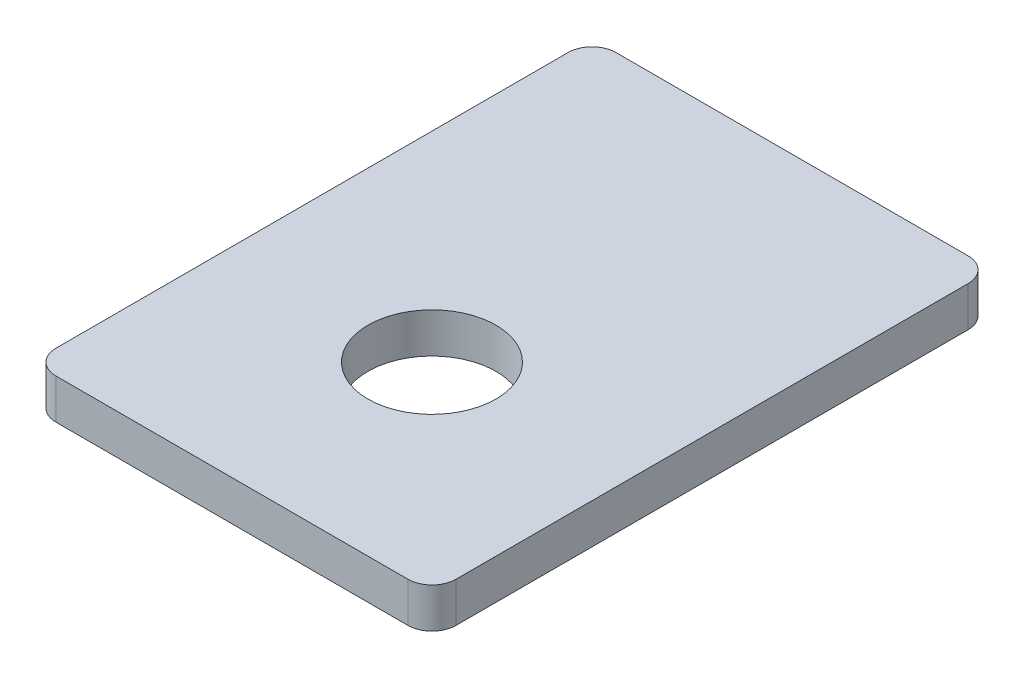
ISO-10303-21;
HEADER;
FILE_DESCRIPTION(('STEP AP214'),'2;1');
FILE_NAME('part.step','',(''),(''),'','','');
FILE_SCHEMA(('AUTOMOTIVE_DESIGN { 1 0 10303 214 1 1 1 1 }'));
ENDSEC;
DATA;
#1=APPLICATION_CONTEXT('core data for automotive mechanical design processes');
#2=APPLICATION_PROTOCOL_DEFINITION('international standard','automotive_design',2000,#1);
#3=PRODUCT_CONTEXT('',#1,'mechanical');
#4=PRODUCT('Part','Part','',(#3));
#5=PRODUCT_RELATED_PRODUCT_CATEGORY('part','',(#4));
#6=PRODUCT_DEFINITION_FORMATION('','',#4);
#7=PRODUCT_DEFINITION_CONTEXT('part definition',#1,'design');
#8=PRODUCT_DEFINITION('design','',#6,#7);
#9=PRODUCT_DEFINITION_SHAPE('','',#8);
#10=(LENGTH_UNIT() NAMED_UNIT(*) SI_UNIT(.MILLI.,.METRE.));
#11=(NAMED_UNIT(*) PLANE_ANGLE_UNIT() SI_UNIT($,.RADIAN.));
#12=(NAMED_UNIT(*) SI_UNIT($,.STERADIAN.) SOLID_ANGLE_UNIT());
#13=UNCERTAINTY_MEASURE_WITH_UNIT(LENGTH_MEASURE(1.E-05),#10,'distance_accuracy_value','');
#14=(GEOMETRIC_REPRESENTATION_CONTEXT(3) GLOBAL_UNCERTAINTY_ASSIGNED_CONTEXT((#13)) GLOBAL_UNIT_ASSIGNED_CONTEXT((#10,
#11,#12)) REPRESENTATION_CONTEXT('',''));
#15=CARTESIAN_POINT('',(0.,0.,0.));
#16=DIRECTION('',(0.,0.,1.));
#17=DIRECTION('',(1.,0.,0.));
#18=AXIS2_PLACEMENT_3D('',#15,#16,#17);
#19=CARTESIAN_POINT('',(0.,5.,70.));
#20=DIRECTION('',(1.,0.,0.));
#21=DIRECTION('',(0.,0.,-1.));
#22=AXIS2_PLACEMENT_3D('',#19,#20,#21);
#23=PLANE('',#22);
#24=DIRECTION('',(0.,0.,-1.));
#25=VECTOR('',#24,1.);
#26=CARTESIAN_POINT('',(0.,5.,70.));
#27=LINE('',#26,#25);
#28=CARTESIAN_POINT('',(0.,5.,67.));
#29=VERTEX_POINT('',#28);
#30=CARTESIAN_POINT('',(0.,5.,3.));
#31=VERTEX_POINT('',#30);
#32=EDGE_CURVE('E160',#29,#31,#27,.T.);
#33=ORIENTED_EDGE('',*,*,#32,.T.);
#34=DIRECTION('',(0.,-1.,0.));
#35=VECTOR('',#34,1.);
#36=CARTESIAN_POINT('',(0.,5.,3.));
#37=LINE('',#36,#35);
#38=CARTESIAN_POINT('',(0.,0.,3.));
#39=VERTEX_POINT('',#38);
#40=EDGE_CURVE('E124',#31,#39,#37,.T.);
#41=ORIENTED_EDGE('',*,*,#40,.T.);
#42=DIRECTION('',(0.,0.,-1.));
#43=VECTOR('',#42,1.);
#44=CARTESIAN_POINT('',(0.,0.,70.));
#45=LINE('',#44,#43);
#46=CARTESIAN_POINT('',(0.,0.,67.));
#47=VERTEX_POINT('',#46);
#48=EDGE_CURVE('E109',#47,#39,#45,.T.);
#49=ORIENTED_EDGE('',*,*,#48,.F.);
#50=DIRECTION('',(0.,-1.,0.));
#51=VECTOR('',#50,1.);
#52=CARTESIAN_POINT('',(0.,5.,67.));
#53=LINE('',#52,#51);
#54=EDGE_CURVE('E121',#47,#29,#53,.F.);
#55=ORIENTED_EDGE('',*,*,#54,.T.);
#56=EDGE_LOOP('',(#33,#41,#49,#55));
#57=FACE_BOUND('',#56,.T.);
#58=ADVANCED_FACE('F39',(#57),#23,.F.);
#59=CARTESIAN_POINT('',(0.,0.,70.));
#60=DIRECTION('',(0.,1.,0.));
#61=DIRECTION('',(0.,0.,1.));
#62=AXIS2_PLACEMENT_3D('',#59,#60,#61);
#63=PLANE('',#62);
#64=CARTESIAN_POINT('',(25.,0.,45.));
#65=DIRECTION('',(0.,1.,0.));
#66=DIRECTION('',(0.,0.,1.));
#67=AXIS2_PLACEMENT_3D('',#64,#65,#66);
#68=CIRCLE('',#67,8.);
#69=CARTESIAN_POINT('',(25.,0.,53.));
#70=VERTEX_POINT('',#69);
#71=EDGE_CURVE('E171',#70,#70,#68,.T.);
#72=ORIENTED_EDGE('',*,*,#71,.T.);
#73=EDGE_LOOP('',(#72));
#74=FACE_BOUND('',#73,.T.);
#75=ORIENTED_EDGE('',*,*,#48,.T.);
#76=CARTESIAN_POINT('',(3.,0.,3.));
#77=DIRECTION('',(0.,1.,0.));
#78=DIRECTION('',(0.,0.,1.));
#79=AXIS2_PLACEMENT_3D('',#76,#77,#78);
#80=CIRCLE('',#79,3.);
#81=CARTESIAN_POINT('',(3.,0.,0.));
#82=VERTEX_POINT('',#81);
#83=EDGE_CURVE('E136',#39,#82,#80,.F.);
#84=ORIENTED_EDGE('',*,*,#83,.T.);
#85=DIRECTION('',(1.,0.,0.));
#86=VECTOR('',#85,1.);
#87=CARTESIAN_POINT('',(0.,0.,0.));
#88=LINE('',#87,#86);
#89=CARTESIAN_POINT('',(47.,0.,0.));
#90=VERTEX_POINT('',#89);
#91=EDGE_CURVE('E168',#82,#90,#88,.T.);
#92=ORIENTED_EDGE('',*,*,#91,.T.);
#93=CARTESIAN_POINT('',(47.,0.,3.));
#94=DIRECTION('',(0.,1.,0.));
#95=DIRECTION('',(0.,0.,1.));
#96=AXIS2_PLACEMENT_3D('',#93,#94,#95);
#97=CIRCLE('',#96,3.);
#98=CARTESIAN_POINT('',(50.,0.,3.));
#99=VERTEX_POINT('',#98);
#100=EDGE_CURVE('E115',#90,#99,#97,.F.);
#101=ORIENTED_EDGE('',*,*,#100,.T.);
#102=DIRECTION('',(0.,0.,-1.));
#103=VECTOR('',#102,1.);
#104=CARTESIAN_POINT('',(50.,0.,70.));
#105=LINE('',#104,#103);
#106=CARTESIAN_POINT('',(50.,0.,67.));
#107=VERTEX_POINT('',#106);
#108=EDGE_CURVE('E125',#107,#99,#105,.T.);
#109=ORIENTED_EDGE('',*,*,#108,.F.);
#110=CARTESIAN_POINT('',(47.,0.,67.));
#111=DIRECTION('',(0.,1.,0.));
#112=DIRECTION('',(0.,0.,1.));
#113=AXIS2_PLACEMENT_3D('',#110,#111,#112);
#114=CIRCLE('',#113,3.);
#115=CARTESIAN_POINT('',(47.,0.,70.));
#116=VERTEX_POINT('',#115);
#117=EDGE_CURVE('E116',#107,#116,#114,.F.);
#118=ORIENTED_EDGE('',*,*,#117,.T.);
#119=DIRECTION('',(1.,0.,0.));
#120=VECTOR('',#119,1.);
#121=CARTESIAN_POINT('',(0.,0.,70.));
#122=LINE('',#121,#120);
#123=CARTESIAN_POINT('',(3.,0.,70.));
#124=VERTEX_POINT('',#123);
#125=EDGE_CURVE('E111',#124,#116,#122,.T.);
#126=ORIENTED_EDGE('',*,*,#125,.F.);
#127=CARTESIAN_POINT('',(3.,0.,67.));
#128=DIRECTION('',(0.,1.,0.));
#129=DIRECTION('',(0.,0.,1.));
#130=AXIS2_PLACEMENT_3D('',#127,#128,#129);
#131=CIRCLE('',#130,3.);
#132=EDGE_CURVE('E106',#124,#47,#131,.F.);
#133=ORIENTED_EDGE('',*,*,#132,.T.);
#134=EDGE_LOOP('',(#75,#84,#92,#101,#109,#118,#126,#133));
#135=FACE_BOUND('',#134,.T.);
#136=ADVANCED_FACE('F108',(#74,#135),#63,.F.);
#137=CARTESIAN_POINT('',(50.,0.,70.));
#138=DIRECTION('',(-1.,0.,0.));
#139=DIRECTION('',(0.,0.,1.));
#140=AXIS2_PLACEMENT_3D('',#137,#138,#139);
#141=PLANE('',#140);
#142=ORIENTED_EDGE('',*,*,#108,.T.);
#143=DIRECTION('',(0.,1.,0.));
#144=VECTOR('',#143,1.);
#145=CARTESIAN_POINT('',(50.,0.,3.));
#146=LINE('',#145,#144);
#147=CARTESIAN_POINT('',(50.,5.,3.));
#148=VERTEX_POINT('',#147);
#149=EDGE_CURVE('E149',#99,#148,#146,.T.);
#150=ORIENTED_EDGE('',*,*,#149,.T.);
#151=DIRECTION('',(0.,0.,-1.));
#152=VECTOR('',#151,1.);
#153=CARTESIAN_POINT('',(50.,5.,70.));
#154=LINE('',#153,#152);
#155=CARTESIAN_POINT('',(50.,5.,67.));
#156=VERTEX_POINT('',#155);
#157=EDGE_CURVE('E162',#156,#148,#154,.T.);
#158=ORIENTED_EDGE('',*,*,#157,.F.);
#159=DIRECTION('',(0.,1.,0.));
#160=VECTOR('',#159,1.);
#161=CARTESIAN_POINT('',(50.,0.,67.));
#162=LINE('',#161,#160);
#163=EDGE_CURVE('E147',#156,#107,#162,.F.);
#164=ORIENTED_EDGE('',*,*,#163,.T.);
#165=EDGE_LOOP('',(#142,#150,#158,#164));
#166=FACE_BOUND('',#165,.T.);
#167=ADVANCED_FACE('F176',(#166),#141,.F.);
#168=CARTESIAN_POINT('',(50.,5.,70.));
#169=DIRECTION('',(0.,-1.,0.));
#170=DIRECTION('',(0.,0.,-1.));
#171=AXIS2_PLACEMENT_3D('',#168,#169,#170);
#172=PLANE('',#171);
#173=CARTESIAN_POINT('',(25.,5.,45.));
#174=DIRECTION('',(0.,1.,0.));
#175=DIRECTION('',(0.,0.,1.));
#176=AXIS2_PLACEMENT_3D('',#173,#174,#175);
#177=CIRCLE('',#176,8.);
#178=CARTESIAN_POINT('',(25.,5.,53.));
#179=VERTEX_POINT('',#178);
#180=EDGE_CURVE('E302',#179,#179,#177,.T.);
#181=ORIENTED_EDGE('',*,*,#180,.F.);
#182=EDGE_LOOP('',(#181));
#183=FACE_BOUND('',#182,.T.);
#184=DIRECTION('',(-1.,0.,0.));
#185=VECTOR('',#184,1.);
#186=CARTESIAN_POINT('',(50.,5.,0.));
#187=LINE('',#186,#185);
#188=CARTESIAN_POINT('',(47.,5.,0.));
#189=VERTEX_POINT('',#188);
#190=CARTESIAN_POINT('',(3.,5.,0.));
#191=VERTEX_POINT('',#190);
#192=EDGE_CURVE('E164',#189,#191,#187,.T.);
#193=ORIENTED_EDGE('',*,*,#192,.T.);
#194=CARTESIAN_POINT('',(3.,5.,3.));
#195=DIRECTION('',(0.,-1.,0.));
#196=DIRECTION('',(0.,0.,-1.));
#197=AXIS2_PLACEMENT_3D('',#194,#195,#196);
#198=CIRCLE('',#197,3.);
#199=EDGE_CURVE('E145',#191,#31,#198,.F.);
#200=ORIENTED_EDGE('',*,*,#199,.T.);
#201=ORIENTED_EDGE('',*,*,#32,.F.);
#202=CARTESIAN_POINT('',(3.,5.,67.));
#203=DIRECTION('',(0.,-1.,0.));
#204=DIRECTION('',(0.,0.,-1.));
#205=AXIS2_PLACEMENT_3D('',#202,#203,#204);
#206=CIRCLE('',#205,3.);
#207=CARTESIAN_POINT('',(3.,5.,70.));
#208=VERTEX_POINT('',#207);
#209=EDGE_CURVE('E129',#29,#208,#206,.F.);
#210=ORIENTED_EDGE('',*,*,#209,.T.);
#211=DIRECTION('',(-1.,0.,0.));
#212=VECTOR('',#211,1.);
#213=CARTESIAN_POINT('',(50.,5.,70.));
#214=LINE('',#213,#212);
#215=CARTESIAN_POINT('',(47.,5.,70.));
#216=VERTEX_POINT('',#215);
#217=EDGE_CURVE('E155',#216,#208,#214,.T.);
#218=ORIENTED_EDGE('',*,*,#217,.F.);
#219=CARTESIAN_POINT('',(47.,5.,67.));
#220=DIRECTION('',(0.,-1.,0.));
#221=DIRECTION('',(0.,0.,-1.));
#222=AXIS2_PLACEMENT_3D('',#219,#220,#221);
#223=CIRCLE('',#222,3.);
#224=EDGE_CURVE('E62',#216,#156,#223,.F.);
#225=ORIENTED_EDGE('',*,*,#224,.T.);
#226=ORIENTED_EDGE('',*,*,#157,.T.);
#227=CARTESIAN_POINT('',(47.,5.,3.));
#228=DIRECTION('',(0.,-1.,0.));
#229=DIRECTION('',(0.,0.,-1.));
#230=AXIS2_PLACEMENT_3D('',#227,#228,#229);
#231=CIRCLE('',#230,3.);
#232=EDGE_CURVE('E54',#148,#189,#231,.F.);
#233=ORIENTED_EDGE('',*,*,#232,.T.);
#234=EDGE_LOOP('',(#193,#200,#201,#210,#218,#225,#226,#233));
#235=FACE_BOUND('',#234,.T.);
#236=ADVANCED_FACE('F159',(#183,#235),#172,.F.);
#237=CARTESIAN_POINT('',(0.,0.,70.));
#238=DIRECTION('',(0.,0.,1.));
#239=DIRECTION('',(1.,0.,0.));
#240=AXIS2_PLACEMENT_3D('',#237,#238,#239);
#241=PLANE('',#240);
#242=ORIENTED_EDGE('',*,*,#217,.T.);
#243=DIRECTION('',(0.,-1.,0.));
#244=VECTOR('',#243,1.);
#245=CARTESIAN_POINT('',(3.,0.,70.));
#246=LINE('',#245,#244);
#247=EDGE_CURVE('E11',#208,#124,#246,.T.);
#248=ORIENTED_EDGE('',*,*,#247,.T.);
#249=ORIENTED_EDGE('',*,*,#125,.T.);
#250=DIRECTION('',(0.,1.,0.));
#251=VECTOR('',#250,1.);
#252=CARTESIAN_POINT('',(47.,5.,70.));
#253=LINE('',#252,#251);
#254=EDGE_CURVE('E47',#116,#216,#253,.T.);
#255=ORIENTED_EDGE('',*,*,#254,.T.);
#256=EDGE_LOOP('',(#242,#248,#249,#255));
#257=FACE_BOUND('',#256,.T.);
#258=ADVANCED_FACE('F154',(#257),#241,.T.);
#259=CARTESIAN_POINT('',(0.,0.,0.));
#260=DIRECTION('',(0.,0.,1.));
#261=DIRECTION('',(1.,0.,0.));
#262=AXIS2_PLACEMENT_3D('',#259,#260,#261);
#263=PLANE('',#262);
#264=ORIENTED_EDGE('',*,*,#91,.F.);
#265=DIRECTION('',(0.,-1.,0.));
#266=VECTOR('',#265,1.);
#267=CARTESIAN_POINT('',(3.,0.,0.));
#268=LINE('',#267,#266);
#269=EDGE_CURVE('E140',#82,#191,#268,.F.);
#270=ORIENTED_EDGE('',*,*,#269,.T.);
#271=ORIENTED_EDGE('',*,*,#192,.F.);
#272=DIRECTION('',(0.,1.,0.));
#273=VECTOR('',#272,1.);
#274=CARTESIAN_POINT('',(47.,0.,0.));
#275=LINE('',#274,#273);
#276=EDGE_CURVE('E138',#189,#90,#275,.F.);
#277=ORIENTED_EDGE('',*,*,#276,.T.);
#278=EDGE_LOOP('',(#264,#270,#271,#277));
#279=FACE_BOUND('',#278,.T.);
#280=ADVANCED_FACE('F183',(#279),#263,.F.);
#281=CARTESIAN_POINT('',(3.,5.,3.));
#282=DIRECTION('',(0.,-1.,0.));
#283=DIRECTION('',(0.,0.,-1.));
#284=AXIS2_PLACEMENT_3D('',#281,#282,#283);
#285=CYLINDRICAL_SURFACE('',#284,3.);
#286=ORIENTED_EDGE('',*,*,#199,.F.);
#287=ORIENTED_EDGE('',*,*,#269,.F.);
#288=ORIENTED_EDGE('',*,*,#83,.F.);
#289=ORIENTED_EDGE('',*,*,#40,.F.);
#290=EDGE_LOOP('',(#286,#287,#288,#289));
#291=FACE_BOUND('',#290,.T.);
#292=ADVANCED_FACE('F187',(#291),#285,.T.);
#293=CARTESIAN_POINT('',(47.,0.,3.));
#294=DIRECTION('',(0.,1.,0.));
#295=DIRECTION('',(0.,0.,1.));
#296=AXIS2_PLACEMENT_3D('',#293,#294,#295);
#297=CYLINDRICAL_SURFACE('',#296,3.);
#298=ORIENTED_EDGE('',*,*,#100,.F.);
#299=ORIENTED_EDGE('',*,*,#276,.F.);
#300=ORIENTED_EDGE('',*,*,#232,.F.);
#301=ORIENTED_EDGE('',*,*,#149,.F.);
#302=EDGE_LOOP('',(#298,#299,#300,#301));
#303=FACE_BOUND('',#302,.T.);
#304=ADVANCED_FACE('F179',(#303),#297,.T.);
#305=CARTESIAN_POINT('',(3.,0.,67.));
#306=DIRECTION('',(0.,1.,0.));
#307=DIRECTION('',(0.,0.,1.));
#308=AXIS2_PLACEMENT_3D('',#305,#306,#307);
#309=CYLINDRICAL_SURFACE('',#308,3.);
#310=ORIENTED_EDGE('',*,*,#209,.F.);
#311=ORIENTED_EDGE('',*,*,#54,.F.);
#312=ORIENTED_EDGE('',*,*,#132,.F.);
#313=ORIENTED_EDGE('',*,*,#247,.F.);
#314=EDGE_LOOP('',(#310,#311,#312,#313));
#315=FACE_BOUND('',#314,.T.);
#316=ADVANCED_FACE('F128',(#315),#309,.T.);
#317=CARTESIAN_POINT('',(47.,0.,67.));
#318=DIRECTION('',(0.,-1.,0.));
#319=DIRECTION('',(0.,0.,-1.));
#320=AXIS2_PLACEMENT_3D('',#317,#318,#319);
#321=CYLINDRICAL_SURFACE('',#320,3.);
#322=ORIENTED_EDGE('',*,*,#117,.F.);
#323=ORIENTED_EDGE('',*,*,#163,.F.);
#324=ORIENTED_EDGE('',*,*,#224,.F.);
#325=ORIENTED_EDGE('',*,*,#254,.F.);
#326=EDGE_LOOP('',(#322,#323,#324,#325));
#327=FACE_BOUND('',#326,.T.);
#328=ADVANCED_FACE('F41',(#327),#321,.T.);
#329=CARTESIAN_POINT('',(25.,0.,45.));
#330=DIRECTION('',(0.,1.,0.));
#331=DIRECTION('',(0.,0.,1.));
#332=AXIS2_PLACEMENT_3D('',#329,#330,#331);
#333=CYLINDRICAL_SURFACE('',#332,8.);
#334=ORIENTED_EDGE('',*,*,#71,.F.);
#335=EDGE_LOOP('',(#334));
#336=FACE_BOUND('',#335,.T.);
#337=ORIENTED_EDGE('',*,*,#180,.T.);
#338=EDGE_LOOP('',(#337));
#339=FACE_BOUND('',#338,.T.);
#340=ADVANCED_FACE('F189',(#336,#339),#333,.F.);
#341=CLOSED_SHELL('',(#58,#136,#167,#236,#258,#280,#292,#304,#316,#328,#340));
#342=MANIFOLD_SOLID_BREP('B2',#341);
#343=ADVANCED_BREP_SHAPE_REPRESENTATION('',(#18,#342),#14);
#344=SHAPE_DEFINITION_REPRESENTATION(#9,#343);
ENDSEC;
END-ISO-10303-21;
